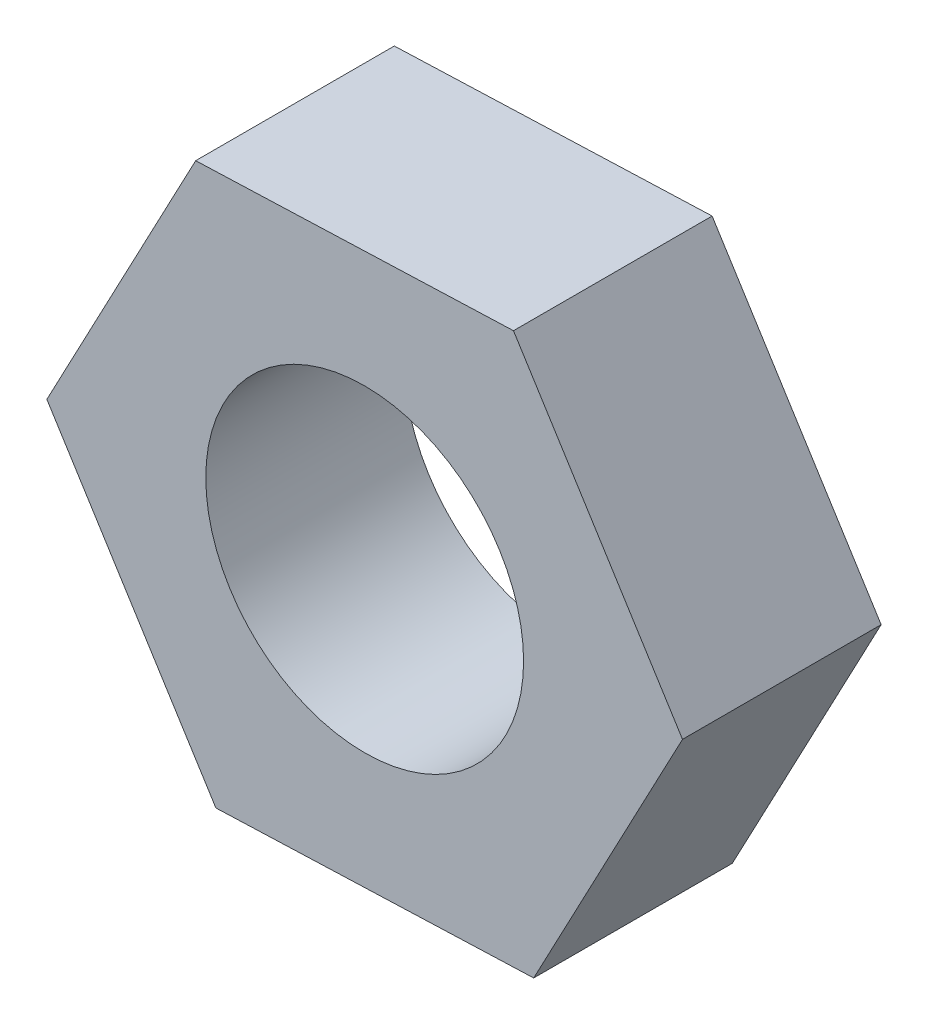
ISO-10303-21;
HEADER;
FILE_DESCRIPTION(('STEP AP214'),'2;1');
FILE_NAME('part.step','',(''),(''),'','','');
FILE_SCHEMA(('AUTOMOTIVE_DESIGN { 1 0 10303 214 1 1 1 1 }'));
ENDSEC;
DATA;
#1=APPLICATION_CONTEXT('core data for automotive mechanical design processes');
#2=APPLICATION_PROTOCOL_DEFINITION('international standard','automotive_design',2000,#1);
#3=PRODUCT_CONTEXT('',#1,'mechanical');
#4=PRODUCT('Part','Part','',(#3));
#5=PRODUCT_RELATED_PRODUCT_CATEGORY('part','',(#4));
#6=PRODUCT_DEFINITION_FORMATION('','',#4);
#7=PRODUCT_DEFINITION_CONTEXT('part definition',#1,'design');
#8=PRODUCT_DEFINITION('design','',#6,#7);
#9=PRODUCT_DEFINITION_SHAPE('','',#8);
#10=(LENGTH_UNIT() NAMED_UNIT(*) SI_UNIT(.MILLI.,.METRE.));
#11=(NAMED_UNIT(*) PLANE_ANGLE_UNIT() SI_UNIT($,.RADIAN.));
#12=(NAMED_UNIT(*) SI_UNIT($,.STERADIAN.) SOLID_ANGLE_UNIT());
#13=UNCERTAINTY_MEASURE_WITH_UNIT(LENGTH_MEASURE(1.E-05),#10,'distance_accuracy_value','');
#14=(GEOMETRIC_REPRESENTATION_CONTEXT(3) GLOBAL_UNCERTAINTY_ASSIGNED_CONTEXT((#13)) GLOBAL_UNIT_ASSIGNED_CONTEXT((#10,
#11,#12)) REPRESENTATION_CONTEXT('',''));
#15=CARTESIAN_POINT('',(0.,0.,0.));
#16=DIRECTION('',(0.,0.,1.));
#17=DIRECTION('',(1.,0.,0.));
#18=AXIS2_PLACEMENT_3D('',#15,#16,#17);
#19=CARTESIAN_POINT('',(4.8,0.176236939239567,3.));
#20=DIRECTION('',(-0.847096610175208,-0.531438926904749,0.));
#21=DIRECTION('',(0.531438926904749,-0.847096610175208,0.));
#22=AXIS2_PLACEMENT_3D('',#19,#20,#21);
#23=PLANE('',#22);
#24=DIRECTION('',(-0.531438926904749,0.847096610175208,0.));
#25=VECTOR('',#24,1.);
#26=CARTESIAN_POINT('',(4.8,0.176236939239567,0.));
#27=LINE('',#26,#25);
#28=CARTESIAN_POINT('',(4.8,0.176236939239567,0.));
#29=VERTEX_POINT('',#28);
#30=CARTESIAN_POINT('',(2.24737433353332,4.24504040778509,0.));
#31=VERTEX_POINT('',#30);
#32=EDGE_CURVE('E128',#29,#31,#27,.T.);
#33=ORIENTED_EDGE('',*,*,#32,.T.);
#34=DIRECTION('',(0.,0.,-1.));
#35=VECTOR('',#34,1.);
#36=CARTESIAN_POINT('',(2.24737433353332,4.24504040778509,3.));
#37=LINE('',#36,#35);
#38=CARTESIAN_POINT('',(2.24737433353332,4.24504040778509,3.));
#39=VERTEX_POINT('',#38);
#40=EDGE_CURVE('E11',#39,#31,#37,.T.);
#41=ORIENTED_EDGE('',*,*,#40,.F.);
#42=DIRECTION('',(-0.531438926904749,0.847096610175208,0.));
#43=VECTOR('',#42,1.);
#44=CARTESIAN_POINT('',(4.8,0.176236939239567,3.));
#45=LINE('',#44,#43);
#46=CARTESIAN_POINT('',(4.8,0.176236939239567,3.));
#47=VERTEX_POINT('',#46);
#48=EDGE_CURVE('E145',#47,#39,#45,.T.);
#49=ORIENTED_EDGE('',*,*,#48,.F.);
#50=DIRECTION('',(0.,0.,-1.));
#51=VECTOR('',#50,1.);
#52=CARTESIAN_POINT('',(4.8,0.176236939239567,3.));
#53=LINE('',#52,#51);
#54=EDGE_CURVE('E124',#47,#29,#53,.T.);
#55=ORIENTED_EDGE('',*,*,#54,.T.);
#56=EDGE_LOOP('',(#33,#41,#49,#55));
#57=FACE_BOUND('',#56,.T.);
#58=ADVANCED_FACE('F39',(#57),#23,.F.);
#59=CARTESIAN_POINT('',(2.24737433353332,4.24504040778509,3.));
#60=DIRECTION('',(0.0366913061718502,-0.999326647323789,0.));
#61=DIRECTION('',(0.999326647323789,0.0366913061718502,0.));
#62=AXIS2_PLACEMENT_3D('',#59,#60,#61);
#63=PLANE('',#62);
#64=DIRECTION('',(-0.999326647323788,-0.0366913061718502,0.));
#65=VECTOR('',#64,1.);
#66=CARTESIAN_POINT('',(2.24737433353332,4.24504040778509,0.));
#67=LINE('',#66,#65);
#68=CARTESIAN_POINT('',(-2.55262566646668,4.06880346854552,0.));
#69=VERTEX_POINT('',#68);
#70=EDGE_CURVE('E132',#31,#69,#67,.T.);
#71=ORIENTED_EDGE('',*,*,#70,.T.);
#72=DIRECTION('',(0.,0.,-1.));
#73=VECTOR('',#72,1.);
#74=CARTESIAN_POINT('',(-2.55262566646668,4.06880346854552,3.));
#75=LINE('',#74,#73);
#76=CARTESIAN_POINT('',(-2.55262566646668,4.06880346854552,3.));
#77=VERTEX_POINT('',#76);
#78=EDGE_CURVE('E48',#77,#69,#75,.T.);
#79=ORIENTED_EDGE('',*,*,#78,.F.);
#80=DIRECTION('',(-0.999326647323788,-0.0366913061718502,0.));
#81=VECTOR('',#80,1.);
#82=CARTESIAN_POINT('',(2.24737433353332,4.24504040778509,3.));
#83=LINE('',#82,#81);
#84=EDGE_CURVE('E93',#39,#77,#83,.T.);
#85=ORIENTED_EDGE('',*,*,#84,.F.);
#86=ORIENTED_EDGE('',*,*,#40,.T.);
#87=EDGE_LOOP('',(#71,#79,#85,#86));
#88=FACE_BOUND('',#87,.T.);
#89=ADVANCED_FACE('F174',(#88),#63,.F.);
#90=CARTESIAN_POINT('',(-2.55262566646668,4.06880346854552,3.));
#91=DIRECTION('',(0.883787916347059,-0.467887720419039,0.));
#92=DIRECTION('',(0.467887720419039,0.883787916347059,0.));
#93=AXIS2_PLACEMENT_3D('',#90,#91,#92);
#94=PLANE('',#93);
#95=DIRECTION('',(-0.467887720419039,-0.883787916347059,0.));
#96=VECTOR('',#95,1.);
#97=CARTESIAN_POINT('',(-2.55262566646668,4.06880346854552,0.));
#98=LINE('',#97,#96);
#99=CARTESIAN_POINT('',(-4.8,-0.176236939239568,0.));
#100=VERTEX_POINT('',#99);
#101=EDGE_CURVE('E136',#69,#100,#98,.T.);
#102=ORIENTED_EDGE('',*,*,#101,.T.);
#103=DIRECTION('',(0.,0.,-1.));
#104=VECTOR('',#103,1.);
#105=CARTESIAN_POINT('',(-4.8,-0.176236939239568,3.));
#106=LINE('',#105,#104);
#107=CARTESIAN_POINT('',(-4.8,-0.176236939239568,3.));
#108=VERTEX_POINT('',#107);
#109=EDGE_CURVE('E117',#108,#100,#106,.T.);
#110=ORIENTED_EDGE('',*,*,#109,.F.);
#111=DIRECTION('',(-0.467887720419039,-0.883787916347059,0.));
#112=VECTOR('',#111,1.);
#113=CARTESIAN_POINT('',(-2.55262566646668,4.06880346854552,3.));
#114=LINE('',#113,#112);
#115=EDGE_CURVE('E106',#77,#108,#114,.T.);
#116=ORIENTED_EDGE('',*,*,#115,.F.);
#117=ORIENTED_EDGE('',*,*,#78,.T.);
#118=EDGE_LOOP('',(#102,#110,#116,#117));
#119=FACE_BOUND('',#118,.T.);
#120=ADVANCED_FACE('F155',(#119),#94,.F.);
#121=CARTESIAN_POINT('',(-4.8,-0.176236939239568,3.));
#122=DIRECTION('',(0.847096610175208,0.53143892690475,0.));
#123=DIRECTION('',(-0.53143892690475,0.847096610175208,0.));
#124=AXIS2_PLACEMENT_3D('',#121,#122,#123);
#125=PLANE('',#124);
#126=DIRECTION('',(0.53143892690475,-0.847096610175208,0.));
#127=VECTOR('',#126,1.);
#128=CARTESIAN_POINT('',(-4.8,-0.176236939239568,0.));
#129=LINE('',#128,#127);
#130=CARTESIAN_POINT('',(-2.24737433353332,-4.24504040778509,0.));
#131=VERTEX_POINT('',#130);
#132=EDGE_CURVE('E115',#100,#131,#129,.T.);
#133=ORIENTED_EDGE('',*,*,#132,.T.);
#134=DIRECTION('',(0.,0.,-1.));
#135=VECTOR('',#134,1.);
#136=CARTESIAN_POINT('',(-2.24737433353332,-4.24504040778509,3.));
#137=LINE('',#136,#135);
#138=CARTESIAN_POINT('',(-2.24737433353332,-4.24504040778509,3.));
#139=VERTEX_POINT('',#138);
#140=EDGE_CURVE('E112',#139,#131,#137,.T.);
#141=ORIENTED_EDGE('',*,*,#140,.F.);
#142=DIRECTION('',(0.53143892690475,-0.847096610175208,0.));
#143=VECTOR('',#142,1.);
#144=CARTESIAN_POINT('',(-4.8,-0.176236939239568,3.));
#145=LINE('',#144,#143);
#146=EDGE_CURVE('E100',#108,#139,#145,.T.);
#147=ORIENTED_EDGE('',*,*,#146,.F.);
#148=ORIENTED_EDGE('',*,*,#109,.T.);
#149=EDGE_LOOP('',(#133,#141,#147,#148));
#150=FACE_BOUND('',#149,.T.);
#151=ADVANCED_FACE('F113',(#150),#125,.F.);
#152=CARTESIAN_POINT('',(-2.24737433353332,-4.24504040778509,3.));
#153=DIRECTION('',(-0.0366913061718506,0.999326647323788,0.));
#154=DIRECTION('',(-0.999326647323789,-0.0366913061718506,0.));
#155=AXIS2_PLACEMENT_3D('',#152,#153,#154);
#156=PLANE('',#155);
#157=DIRECTION('',(0.999326647323789,0.0366913061718506,0.));
#158=VECTOR('',#157,1.);
#159=CARTESIAN_POINT('',(-2.24737433353332,-4.24504040778509,0.));
#160=LINE('',#159,#158);
#161=CARTESIAN_POINT('',(2.55262566646668,-4.06880346854552,0.));
#162=VERTEX_POINT('',#161);
#163=EDGE_CURVE('E79',#131,#162,#160,.T.);
#164=ORIENTED_EDGE('',*,*,#163,.T.);
#165=DIRECTION('',(0.,0.,-1.));
#166=VECTOR('',#165,1.);
#167=CARTESIAN_POINT('',(2.55262566646668,-4.06880346854552,3.));
#168=LINE('',#167,#166);
#169=CARTESIAN_POINT('',(2.55262566646668,-4.06880346854552,3.));
#170=VERTEX_POINT('',#169);
#171=EDGE_CURVE('E118',#170,#162,#168,.T.);
#172=ORIENTED_EDGE('',*,*,#171,.F.);
#173=DIRECTION('',(0.999326647323789,0.0366913061718506,0.));
#174=VECTOR('',#173,1.);
#175=CARTESIAN_POINT('',(-2.24737433353332,-4.24504040778509,3.));
#176=LINE('',#175,#174);
#177=EDGE_CURVE('E104',#139,#170,#176,.T.);
#178=ORIENTED_EDGE('',*,*,#177,.F.);
#179=ORIENTED_EDGE('',*,*,#140,.T.);
#180=EDGE_LOOP('',(#164,#172,#178,#179));
#181=FACE_BOUND('',#180,.T.);
#182=ADVANCED_FACE('F120',(#181),#156,.F.);
#183=CARTESIAN_POINT('',(2.55262566646668,-4.06880346854552,3.));
#184=DIRECTION('',(-0.883787916347059,0.467887720419039,0.));
#185=DIRECTION('',(-0.467887720419039,-0.883787916347059,0.));
#186=AXIS2_PLACEMENT_3D('',#183,#184,#185);
#187=PLANE('',#186);
#188=DIRECTION('',(0.467887720419039,0.883787916347058,0.));
#189=VECTOR('',#188,1.);
#190=CARTESIAN_POINT('',(2.55262566646668,-4.06880346854552,0.));
#191=LINE('',#190,#189);
#192=EDGE_CURVE('E85',#162,#29,#191,.T.);
#193=ORIENTED_EDGE('',*,*,#192,.T.);
#194=ORIENTED_EDGE('',*,*,#54,.F.);
#195=DIRECTION('',(0.467887720419039,0.883787916347058,0.));
#196=VECTOR('',#195,1.);
#197=CARTESIAN_POINT('',(2.55262566646668,-4.06880346854552,3.));
#198=LINE('',#197,#196);
#199=EDGE_CURVE('E56',#170,#47,#198,.T.);
#200=ORIENTED_EDGE('',*,*,#199,.F.);
#201=ORIENTED_EDGE('',*,*,#171,.T.);
#202=EDGE_LOOP('',(#193,#194,#200,#201));
#203=FACE_BOUND('',#202,.T.);
#204=ADVANCED_FACE('F162',(#203),#187,.F.);
#205=CARTESIAN_POINT('',(0.,0.,3.));
#206=DIRECTION('',(0.,0.,1.));
#207=DIRECTION('',(1.,0.,0.));
#208=AXIS2_PLACEMENT_3D('',#205,#206,#207);
#209=PLANE('',#208);
#210=CARTESIAN_POINT('',(0.,0.,3.));
#211=DIRECTION('',(0.,0.,-1.));
#212=DIRECTION('',(-1.,0.,0.));
#213=AXIS2_PLACEMENT_3D('',#210,#211,#212);
#214=CIRCLE('',#213,2.4);
#215=CARTESIAN_POINT('',(-2.4,0.,3.));
#216=VERTEX_POINT('',#215);
#217=EDGE_CURVE('E133',#216,#216,#214,.T.);
#218=ORIENTED_EDGE('',*,*,#217,.T.);
#219=EDGE_LOOP('',(#218));
#220=FACE_BOUND('',#219,.T.);
#221=ORIENTED_EDGE('',*,*,#48,.T.);
#222=ORIENTED_EDGE('',*,*,#84,.T.);
#223=ORIENTED_EDGE('',*,*,#115,.T.);
#224=ORIENTED_EDGE('',*,*,#146,.T.);
#225=ORIENTED_EDGE('',*,*,#177,.T.);
#226=ORIENTED_EDGE('',*,*,#199,.T.);
#227=EDGE_LOOP('',(#221,#222,#223,#224,#225,#226));
#228=FACE_BOUND('',#227,.T.);
#229=ADVANCED_FACE('F102',(#220,#228),#209,.T.);
#230=CARTESIAN_POINT('',(0.,0.,0.));
#231=DIRECTION('',(0.,0.,1.));
#232=DIRECTION('',(1.,0.,0.));
#233=AXIS2_PLACEMENT_3D('',#230,#231,#232);
#234=PLANE('',#233);
#235=CARTESIAN_POINT('',(0.,0.,0.));
#236=DIRECTION('',(0.,0.,-1.));
#237=DIRECTION('',(-1.,0.,0.));
#238=AXIS2_PLACEMENT_3D('',#235,#236,#237);
#239=CIRCLE('',#238,2.4);
#240=CARTESIAN_POINT('',(-2.4,0.,0.));
#241=VERTEX_POINT('',#240);
#242=EDGE_CURVE('E229',#241,#241,#239,.T.);
#243=ORIENTED_EDGE('',*,*,#242,.F.);
#244=EDGE_LOOP('',(#243));
#245=FACE_BOUND('',#244,.T.);
#246=ORIENTED_EDGE('',*,*,#32,.F.);
#247=ORIENTED_EDGE('',*,*,#192,.F.);
#248=ORIENTED_EDGE('',*,*,#163,.F.);
#249=ORIENTED_EDGE('',*,*,#132,.F.);
#250=ORIENTED_EDGE('',*,*,#101,.F.);
#251=ORIENTED_EDGE('',*,*,#70,.F.);
#252=EDGE_LOOP('',(#246,#247,#248,#249,#250,#251));
#253=FACE_BOUND('',#252,.T.);
#254=ADVANCED_FACE('F158',(#245,#253),#234,.F.);
#255=CARTESIAN_POINT('',(0.,0.,3.));
#256=DIRECTION('',(0.,0.,-1.));
#257=DIRECTION('',(-1.,0.,0.));
#258=AXIS2_PLACEMENT_3D('',#255,#256,#257);
#259=CYLINDRICAL_SURFACE('',#258,2.4);
#260=ORIENTED_EDGE('',*,*,#217,.F.);
#261=EDGE_LOOP('',(#260));
#262=FACE_BOUND('',#261,.T.);
#263=ORIENTED_EDGE('',*,*,#242,.T.);
#264=EDGE_LOOP('',(#263));
#265=FACE_BOUND('',#264,.T.);
#266=ADVANCED_FACE('F211',(#262,#265),#259,.F.);
#267=CLOSED_SHELL('',(#58,#89,#120,#151,#182,#204,#229,#254,#266));
#268=MANIFOLD_SOLID_BREP('B2',#267);
#269=ADVANCED_BREP_SHAPE_REPRESENTATION('',(#18,#268),#14);
#270=SHAPE_DEFINITION_REPRESENTATION(#9,#269);
ENDSEC;
END-ISO-10303-21;
